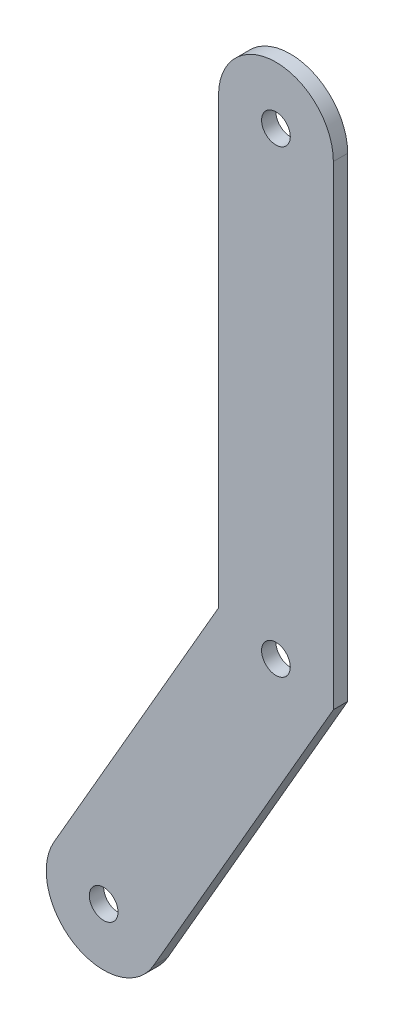
ISO-10303-21;
HEADER;
FILE_DESCRIPTION(('STEP AP214'),'2;1');
FILE_NAME('part.step','',(''),(''),'','','');
FILE_SCHEMA(('AUTOMOTIVE_DESIGN { 1 0 10303 214 1 1 1 1 }'));
ENDSEC;
DATA;
#1=APPLICATION_CONTEXT('core data for automotive mechanical design processes');
#2=APPLICATION_PROTOCOL_DEFINITION('international standard','automotive_design',2000,#1);
#3=PRODUCT_CONTEXT('',#1,'mechanical');
#4=PRODUCT('Part','Part','',(#3));
#5=PRODUCT_RELATED_PRODUCT_CATEGORY('part','',(#4));
#6=PRODUCT_DEFINITION_FORMATION('','',#4);
#7=PRODUCT_DEFINITION_CONTEXT('part definition',#1,'design');
#8=PRODUCT_DEFINITION('design','',#6,#7);
#9=PRODUCT_DEFINITION_SHAPE('','',#8);
#10=(LENGTH_UNIT() NAMED_UNIT(*) SI_UNIT(.MILLI.,.METRE.));
#11=(NAMED_UNIT(*) PLANE_ANGLE_UNIT() SI_UNIT($,.RADIAN.));
#12=(NAMED_UNIT(*) SI_UNIT($,.STERADIAN.) SOLID_ANGLE_UNIT());
#13=UNCERTAINTY_MEASURE_WITH_UNIT(LENGTH_MEASURE(1.E-05),#10,'distance_accuracy_value','');
#14=(GEOMETRIC_REPRESENTATION_CONTEXT(3) GLOBAL_UNCERTAINTY_ASSIGNED_CONTEXT((#13)) GLOBAL_UNIT_ASSIGNED_CONTEXT((#10,
#11,#12)) REPRESENTATION_CONTEXT('',''));
#15=CARTESIAN_POINT('',(0.,0.,0.));
#16=DIRECTION('',(0.,0.,1.));
#17=DIRECTION('',(1.,0.,0.));
#18=AXIS2_PLACEMENT_3D('',#15,#16,#17);
#19=CARTESIAN_POINT('',(-152.4,-670.364543073497,12.7));
#20=DIRECTION('',(0.,0.,1.));
#21=DIRECTION('',(1.,0.,0.));
#22=AXIS2_PLACEMENT_3D('',#19,#20,#21);
#23=PLANE('',#22);
#24=CARTESIAN_POINT('',(0.,0.,12.7));
#25=DIRECTION('',(0.,0.,1.));
#26=DIRECTION('',(1.,0.,0.));
#27=AXIS2_PLACEMENT_3D('',#24,#25,#26);
#28=CIRCLE('',#27,12.7);
#29=CARTESIAN_POINT('',(12.7,0.,12.7));
#30=VERTEX_POINT('',#29);
#31=EDGE_CURVE('E198',#30,#30,#28,.T.);
#32=ORIENTED_EDGE('',*,*,#31,.F.);
#33=EDGE_LOOP('',(#32));
#34=FACE_BOUND('',#33,.T.);
#35=CARTESIAN_POINT('',(-152.4,-670.364543073497,12.7));
#36=DIRECTION('',(0.,0.,1.));
#37=DIRECTION('',(1.,0.,0.));
#38=AXIS2_PLACEMENT_3D('',#35,#36,#37);
#39=CIRCLE('',#38,50.8);
#40=CARTESIAN_POINT('',(-196.39409051225,-644.964543073497,12.7));
#41=VERTEX_POINT('',#40);
#42=CARTESIAN_POINT('',(-108.405909487751,-695.764543073497,12.7));
#43=VERTEX_POINT('',#42);
#44=EDGE_CURVE('E142',#41,#43,#39,.T.);
#45=ORIENTED_EDGE('',*,*,#44,.T.);
#46=DIRECTION('',(0.500000000000001,0.866025403784438,0.));
#47=VECTOR('',#46,1.);
#48=CARTESIAN_POINT('',(-108.405909487751,-695.764543073497,12.7));
#49=LINE('',#48,#47);
#50=CARTESIAN_POINT('',(50.8,-420.011818975501,12.7));
#51=VERTEX_POINT('',#50);
#52=EDGE_CURVE('E97',#43,#51,#49,.T.);
#53=ORIENTED_EDGE('',*,*,#52,.T.);
#54=DIRECTION('',(0.,1.,0.));
#55=VECTOR('',#54,1.);
#56=CARTESIAN_POINT('',(50.8,-420.011818975501,12.7));
#57=LINE('',#56,#55);
#58=CARTESIAN_POINT('',(50.8,0.,12.7));
#59=VERTEX_POINT('',#58);
#60=EDGE_CURVE('E110',#51,#59,#57,.T.);
#61=ORIENTED_EDGE('',*,*,#60,.T.);
#62=CARTESIAN_POINT('',(0.,0.,12.7));
#63=DIRECTION('',(0.,0.,1.));
#64=DIRECTION('',(1.,0.,0.));
#65=AXIS2_PLACEMENT_3D('',#62,#63,#64);
#66=CIRCLE('',#65,50.8);
#67=CARTESIAN_POINT('',(-50.8,0.,12.7));
#68=VERTEX_POINT('',#67);
#69=EDGE_CURVE('E104',#59,#68,#66,.T.);
#70=ORIENTED_EDGE('',*,*,#69,.T.);
#71=DIRECTION('',(0.,-1.,0.));
#72=VECTOR('',#71,1.);
#73=CARTESIAN_POINT('',(-50.8,0.,12.7));
#74=LINE('',#73,#72);
#75=CARTESIAN_POINT('',(-50.7999999999999,-392.788181024499,12.7));
#76=VERTEX_POINT('',#75);
#77=EDGE_CURVE('E108',#68,#76,#74,.T.);
#78=ORIENTED_EDGE('',*,*,#77,.T.);
#79=DIRECTION('',(-0.500000000000001,-0.866025403784438,0.));
#80=VECTOR('',#79,1.);
#81=CARTESIAN_POINT('',(-50.7999999999999,-392.788181024499,12.7));
#82=LINE('',#81,#80);
#83=EDGE_CURVE('E60',#76,#41,#82,.T.);
#84=ORIENTED_EDGE('',*,*,#83,.T.);
#85=EDGE_LOOP('',(#45,#53,#61,#70,#78,#84));
#86=FACE_BOUND('',#85,.T.);
#87=CARTESIAN_POINT('',(-152.4,-670.364543073497,12.7));
#88=DIRECTION('',(0.,0.,1.));
#89=DIRECTION('',(1.,0.,0.));
#90=AXIS2_PLACEMENT_3D('',#87,#88,#89);
#91=CIRCLE('',#90,12.7000000000005);
#92=CARTESIAN_POINT('',(-139.7,-670.364543073497,12.7));
#93=VERTEX_POINT('',#92);
#94=EDGE_CURVE('E134',#93,#93,#91,.T.);
#95=ORIENTED_EDGE('',*,*,#94,.F.);
#96=EDGE_LOOP('',(#95));
#97=FACE_BOUND('',#96,.T.);
#98=CARTESIAN_POINT('',(-1.73472347597681E-13,-406.4,12.7));
#99=DIRECTION('',(0.,0.,1.));
#100=DIRECTION('',(1.,0.,0.));
#101=AXIS2_PLACEMENT_3D('',#98,#99,#100);
#102=CIRCLE('',#101,12.7000000000002);
#103=CARTESIAN_POINT('',(12.7,-406.4,12.7));
#104=VERTEX_POINT('',#103);
#105=EDGE_CURVE('E189',#104,#104,#102,.T.);
#106=ORIENTED_EDGE('',*,*,#105,.F.);
#107=EDGE_LOOP('',(#106));
#108=FACE_BOUND('',#107,.T.);
#109=ADVANCED_FACE('F41',(#34,#86,#97,#108),#23,.T.);
#110=CARTESIAN_POINT('',(-152.4,-670.364543073497,0.));
#111=DIRECTION('',(0.,0.,1.));
#112=DIRECTION('',(1.,0.,0.));
#113=AXIS2_PLACEMENT_3D('',#110,#111,#112);
#114=PLANE('',#113);
#115=CARTESIAN_POINT('',(-152.4,-670.364543073497,0.));
#116=DIRECTION('',(0.,0.,1.));
#117=DIRECTION('',(1.,0.,0.));
#118=AXIS2_PLACEMENT_3D('',#115,#116,#117);
#119=CIRCLE('',#118,50.8);
#120=CARTESIAN_POINT('',(-196.39409051225,-644.964543073497,0.));
#121=VERTEX_POINT('',#120);
#122=CARTESIAN_POINT('',(-108.405909487751,-695.764543073497,0.));
#123=VERTEX_POINT('',#122);
#124=EDGE_CURVE('E129',#121,#123,#119,.T.);
#125=ORIENTED_EDGE('',*,*,#124,.F.);
#126=DIRECTION('',(-0.500000000000001,-0.866025403784438,0.));
#127=VECTOR('',#126,1.);
#128=CARTESIAN_POINT('',(-50.7999999999999,-392.788181024499,0.));
#129=LINE('',#128,#127);
#130=CARTESIAN_POINT('',(-50.7999999999999,-392.788181024499,0.));
#131=VERTEX_POINT('',#130);
#132=EDGE_CURVE('E89',#131,#121,#129,.T.);
#133=ORIENTED_EDGE('',*,*,#132,.F.);
#134=DIRECTION('',(0.,-1.,0.));
#135=VECTOR('',#134,1.);
#136=CARTESIAN_POINT('',(-50.8,0.,0.));
#137=LINE('',#136,#135);
#138=CARTESIAN_POINT('',(-50.8,0.,0.));
#139=VERTEX_POINT('',#138);
#140=EDGE_CURVE('E83',#139,#131,#137,.T.);
#141=ORIENTED_EDGE('',*,*,#140,.F.);
#142=CARTESIAN_POINT('',(0.,0.,0.));
#143=DIRECTION('',(0.,0.,1.));
#144=DIRECTION('',(1.,0.,0.));
#145=AXIS2_PLACEMENT_3D('',#142,#143,#144);
#146=CIRCLE('',#145,50.8);
#147=CARTESIAN_POINT('',(50.8,0.,0.));
#148=VERTEX_POINT('',#147);
#149=EDGE_CURVE('E118',#148,#139,#146,.T.);
#150=ORIENTED_EDGE('',*,*,#149,.F.);
#151=DIRECTION('',(0.,1.,0.));
#152=VECTOR('',#151,1.);
#153=CARTESIAN_POINT('',(50.8,-420.011818975501,0.));
#154=LINE('',#153,#152);
#155=CARTESIAN_POINT('',(50.8,-420.011818975501,0.));
#156=VERTEX_POINT('',#155);
#157=EDGE_CURVE('E136',#156,#148,#154,.T.);
#158=ORIENTED_EDGE('',*,*,#157,.F.);
#159=DIRECTION('',(0.500000000000001,0.866025403784438,0.));
#160=VECTOR('',#159,1.);
#161=CARTESIAN_POINT('',(-108.405909487751,-695.764543073497,0.));
#162=LINE('',#161,#160);
#163=EDGE_CURVE('E133',#123,#156,#162,.T.);
#164=ORIENTED_EDGE('',*,*,#163,.F.);
#165=EDGE_LOOP('',(#125,#133,#141,#150,#158,#164));
#166=FACE_BOUND('',#165,.T.);
#167=CARTESIAN_POINT('',(-152.4,-670.364543073497,0.));
#168=DIRECTION('',(0.,0.,1.));
#169=DIRECTION('',(1.,0.,0.));
#170=AXIS2_PLACEMENT_3D('',#167,#168,#169);
#171=CIRCLE('',#170,12.7000000000005);
#172=CARTESIAN_POINT('',(-139.7,-670.364543073497,0.));
#173=VERTEX_POINT('',#172);
#174=EDGE_CURVE('E201',#173,#173,#171,.T.);
#175=ORIENTED_EDGE('',*,*,#174,.T.);
#176=EDGE_LOOP('',(#175));
#177=FACE_BOUND('',#176,.T.);
#178=CARTESIAN_POINT('',(0.,0.,0.));
#179=DIRECTION('',(0.,0.,1.));
#180=DIRECTION('',(1.,0.,0.));
#181=AXIS2_PLACEMENT_3D('',#178,#179,#180);
#182=CIRCLE('',#181,12.7);
#183=CARTESIAN_POINT('',(12.7,0.,0.));
#184=VERTEX_POINT('',#183);
#185=EDGE_CURVE('E195',#184,#184,#182,.T.);
#186=ORIENTED_EDGE('',*,*,#185,.T.);
#187=EDGE_LOOP('',(#186));
#188=FACE_BOUND('',#187,.T.);
#189=CARTESIAN_POINT('',(-1.73472347597681E-13,-406.4,0.));
#190=DIRECTION('',(0.,0.,1.));
#191=DIRECTION('',(1.,0.,0.));
#192=AXIS2_PLACEMENT_3D('',#189,#190,#191);
#193=CIRCLE('',#192,12.7000000000002);
#194=CARTESIAN_POINT('',(12.7,-406.4,0.));
#195=VERTEX_POINT('',#194);
#196=EDGE_CURVE('E192',#195,#195,#193,.T.);
#197=ORIENTED_EDGE('',*,*,#196,.T.);
#198=EDGE_LOOP('',(#197));
#199=FACE_BOUND('',#198,.T.);
#200=ADVANCED_FACE('F152',(#166,#177,#188,#199),#114,.F.);
#201=CARTESIAN_POINT('',(-152.4,-670.364543073497,12.7));
#202=DIRECTION('',(0.,0.,-1.));
#203=DIRECTION('',(-1.,0.,0.));
#204=AXIS2_PLACEMENT_3D('',#201,#202,#203);
#205=CYLINDRICAL_SURFACE('',#204,50.8);
#206=ORIENTED_EDGE('',*,*,#124,.T.);
#207=DIRECTION('',(0.,0.,-1.));
#208=VECTOR('',#207,1.);
#209=CARTESIAN_POINT('',(-108.405909487751,-695.764543073497,12.7));
#210=LINE('',#209,#208);
#211=EDGE_CURVE('E11',#43,#123,#210,.T.);
#212=ORIENTED_EDGE('',*,*,#211,.F.);
#213=ORIENTED_EDGE('',*,*,#44,.F.);
#214=DIRECTION('',(0.,0.,-1.));
#215=VECTOR('',#214,1.);
#216=CARTESIAN_POINT('',(-196.39409051225,-644.964543073497,12.7));
#217=LINE('',#216,#215);
#218=EDGE_CURVE('E125',#41,#121,#217,.T.);
#219=ORIENTED_EDGE('',*,*,#218,.T.);
#220=EDGE_LOOP('',(#206,#212,#213,#219));
#221=FACE_BOUND('',#220,.T.);
#222=ADVANCED_FACE('F43',(#221),#205,.T.);
#223=CARTESIAN_POINT('',(-108.405909487751,-695.764543073497,12.7));
#224=DIRECTION('',(-0.866025403784438,0.500000000000001,0.));
#225=DIRECTION('',(-0.500000000000001,-0.866025403784438,0.));
#226=AXIS2_PLACEMENT_3D('',#223,#224,#225);
#227=PLANE('',#226);
#228=ORIENTED_EDGE('',*,*,#163,.T.);
#229=DIRECTION('',(0.,0.,-1.));
#230=VECTOR('',#229,1.);
#231=CARTESIAN_POINT('',(50.8,-420.011818975501,12.7));
#232=LINE('',#231,#230);
#233=EDGE_CURVE('E50',#51,#156,#232,.T.);
#234=ORIENTED_EDGE('',*,*,#233,.F.);
#235=ORIENTED_EDGE('',*,*,#52,.F.);
#236=ORIENTED_EDGE('',*,*,#211,.T.);
#237=EDGE_LOOP('',(#228,#234,#235,#236));
#238=FACE_BOUND('',#237,.T.);
#239=ADVANCED_FACE('F254',(#238),#227,.F.);
#240=CARTESIAN_POINT('',(50.8,-420.011818975501,12.7));
#241=DIRECTION('',(-1.,0.,0.));
#242=DIRECTION('',(0.,-1.,0.));
#243=AXIS2_PLACEMENT_3D('',#240,#241,#242);
#244=PLANE('',#243);
#245=ORIENTED_EDGE('',*,*,#157,.T.);
#246=DIRECTION('',(0.,0.,-1.));
#247=VECTOR('',#246,1.);
#248=CARTESIAN_POINT('',(50.8,0.,12.7));
#249=LINE('',#248,#247);
#250=EDGE_CURVE('E119',#59,#148,#249,.T.);
#251=ORIENTED_EDGE('',*,*,#250,.F.);
#252=ORIENTED_EDGE('',*,*,#60,.F.);
#253=ORIENTED_EDGE('',*,*,#233,.T.);
#254=EDGE_LOOP('',(#245,#251,#252,#253));
#255=FACE_BOUND('',#254,.T.);
#256=ADVANCED_FACE('F149',(#255),#244,.F.);
#257=CARTESIAN_POINT('',(0.,0.,12.7));
#258=DIRECTION('',(0.,0.,-1.));
#259=DIRECTION('',(-1.,0.,0.));
#260=AXIS2_PLACEMENT_3D('',#257,#258,#259);
#261=CYLINDRICAL_SURFACE('',#260,50.8);
#262=ORIENTED_EDGE('',*,*,#149,.T.);
#263=DIRECTION('',(0.,0.,-1.));
#264=VECTOR('',#263,1.);
#265=CARTESIAN_POINT('',(-50.8,0.,12.7));
#266=LINE('',#265,#264);
#267=EDGE_CURVE('E115',#68,#139,#266,.T.);
#268=ORIENTED_EDGE('',*,*,#267,.F.);
#269=ORIENTED_EDGE('',*,*,#69,.F.);
#270=ORIENTED_EDGE('',*,*,#250,.T.);
#271=EDGE_LOOP('',(#262,#268,#269,#270));
#272=FACE_BOUND('',#271,.T.);
#273=ADVANCED_FACE('F116',(#272),#261,.T.);
#274=CARTESIAN_POINT('',(-50.8,0.,12.7));
#275=DIRECTION('',(1.,0.,0.));
#276=DIRECTION('',(0.,1.,0.));
#277=AXIS2_PLACEMENT_3D('',#274,#275,#276);
#278=PLANE('',#277);
#279=ORIENTED_EDGE('',*,*,#140,.T.);
#280=DIRECTION('',(0.,0.,-1.));
#281=VECTOR('',#280,1.);
#282=CARTESIAN_POINT('',(-50.7999999999999,-392.788181024499,12.7));
#283=LINE('',#282,#281);
#284=EDGE_CURVE('E120',#76,#131,#283,.T.);
#285=ORIENTED_EDGE('',*,*,#284,.F.);
#286=ORIENTED_EDGE('',*,*,#77,.F.);
#287=ORIENTED_EDGE('',*,*,#267,.T.);
#288=EDGE_LOOP('',(#279,#285,#286,#287));
#289=FACE_BOUND('',#288,.T.);
#290=ADVANCED_FACE('F122',(#289),#278,.F.);
#291=CARTESIAN_POINT('',(-50.7999999999999,-392.788181024499,12.7));
#292=DIRECTION('',(0.866025403784438,-0.500000000000001,0.));
#293=DIRECTION('',(0.500000000000001,0.866025403784438,0.));
#294=AXIS2_PLACEMENT_3D('',#291,#292,#293);
#295=PLANE('',#294);
#296=ORIENTED_EDGE('',*,*,#132,.T.);
#297=ORIENTED_EDGE('',*,*,#218,.F.);
#298=ORIENTED_EDGE('',*,*,#83,.F.);
#299=ORIENTED_EDGE('',*,*,#284,.T.);
#300=EDGE_LOOP('',(#296,#297,#298,#299));
#301=FACE_BOUND('',#300,.T.);
#302=ADVANCED_FACE('F157',(#301),#295,.F.);
#303=CARTESIAN_POINT('',(-152.4,-670.364543073497,12.7));
#304=DIRECTION('',(0.,0.,-1.));
#305=DIRECTION('',(-1.,0.,0.));
#306=AXIS2_PLACEMENT_3D('',#303,#304,#305);
#307=CYLINDRICAL_SURFACE('',#306,12.7000000000005);
#308=ORIENTED_EDGE('',*,*,#94,.T.);
#309=EDGE_LOOP('',(#308));
#310=FACE_BOUND('',#309,.T.);
#311=ORIENTED_EDGE('',*,*,#174,.F.);
#312=EDGE_LOOP('',(#311));
#313=FACE_BOUND('',#312,.T.);
#314=ADVANCED_FACE('F159',(#310,#313),#307,.F.);
#315=CARTESIAN_POINT('',(0.,0.,12.7));
#316=DIRECTION('',(0.,0.,-1.));
#317=DIRECTION('',(-1.,0.,0.));
#318=AXIS2_PLACEMENT_3D('',#315,#316,#317);
#319=CYLINDRICAL_SURFACE('',#318,12.7);
#320=ORIENTED_EDGE('',*,*,#31,.T.);
#321=EDGE_LOOP('',(#320));
#322=FACE_BOUND('',#321,.T.);
#323=ORIENTED_EDGE('',*,*,#185,.F.);
#324=EDGE_LOOP('',(#323));
#325=FACE_BOUND('',#324,.T.);
#326=ADVANCED_FACE('F165',(#322,#325),#319,.F.);
#327=CARTESIAN_POINT('',(-1.73472347597681E-13,-406.4,12.7));
#328=DIRECTION('',(0.,0.,-1.));
#329=DIRECTION('',(-1.,0.,0.));
#330=AXIS2_PLACEMENT_3D('',#327,#328,#329);
#331=CYLINDRICAL_SURFACE('',#330,12.7000000000002);
#332=ORIENTED_EDGE('',*,*,#105,.T.);
#333=EDGE_LOOP('',(#332));
#334=FACE_BOUND('',#333,.T.);
#335=ORIENTED_EDGE('',*,*,#196,.F.);
#336=EDGE_LOOP('',(#335));
#337=FACE_BOUND('',#336,.T.);
#338=ADVANCED_FACE('F180',(#334,#337),#331,.F.);
#339=CLOSED_SHELL('',(#109,#200,#222,#239,#256,#273,#290,#302,#314,#326,#338));
#340=MANIFOLD_SOLID_BREP('B2',#339);
#341=ADVANCED_BREP_SHAPE_REPRESENTATION('',(#18,#340),#14);
#342=SHAPE_DEFINITION_REPRESENTATION(#9,#341);
ENDSEC;
END-ISO-10303-21;
